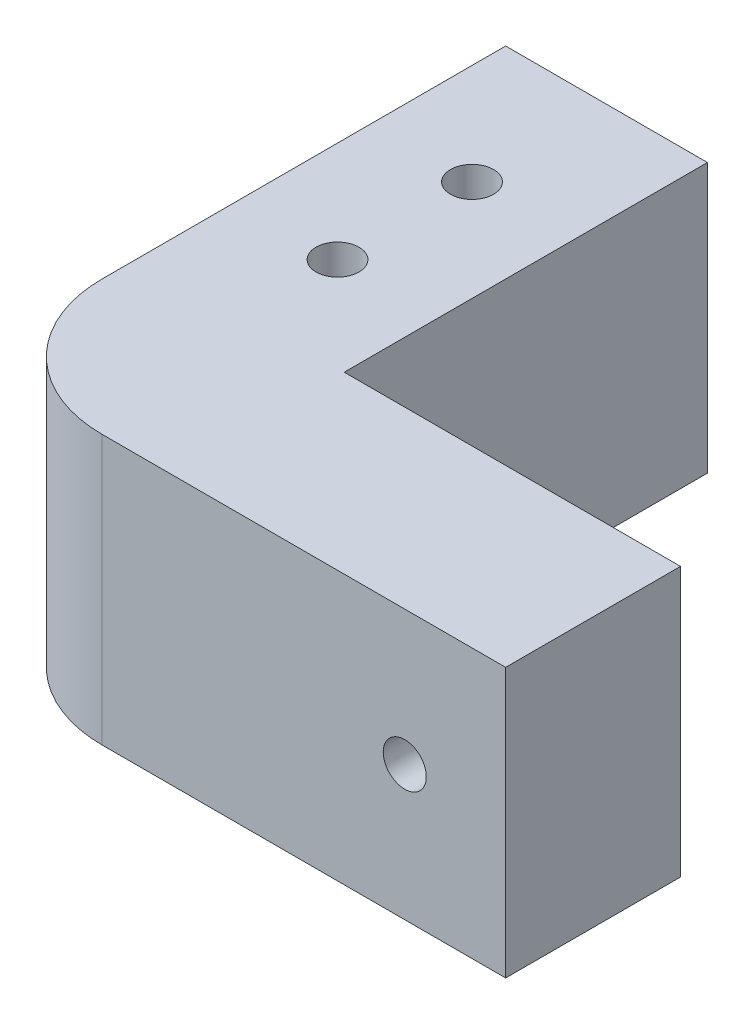
ISO-10303-21;
HEADER;
FILE_DESCRIPTION(('STEP AP214'),'2;1');
FILE_NAME('part.step','',(''),(''),'','','');
FILE_SCHEMA(('AUTOMOTIVE_DESIGN { 1 0 10303 214 1 1 1 1 }'));
ENDSEC;
DATA;
#1=APPLICATION_CONTEXT('core data for automotive mechanical design processes');
#2=APPLICATION_PROTOCOL_DEFINITION('international standard','automotive_design',2000,#1);
#3=PRODUCT_CONTEXT('',#1,'mechanical');
#4=PRODUCT('Part','Part','',(#3));
#5=PRODUCT_RELATED_PRODUCT_CATEGORY('part','',(#4));
#6=PRODUCT_DEFINITION_FORMATION('','',#4);
#7=PRODUCT_DEFINITION_CONTEXT('part definition',#1,'design');
#8=PRODUCT_DEFINITION('design','',#6,#7);
#9=PRODUCT_DEFINITION_SHAPE('','',#8);
#10=(LENGTH_UNIT() NAMED_UNIT(*) SI_UNIT(.MILLI.,.METRE.));
#11=(NAMED_UNIT(*) PLANE_ANGLE_UNIT() SI_UNIT($,.RADIAN.));
#12=(NAMED_UNIT(*) SI_UNIT($,.STERADIAN.) SOLID_ANGLE_UNIT());
#13=UNCERTAINTY_MEASURE_WITH_UNIT(LENGTH_MEASURE(1.E-05),#10,'distance_accuracy_value','');
#14=(GEOMETRIC_REPRESENTATION_CONTEXT(3) GLOBAL_UNCERTAINTY_ASSIGNED_CONTEXT((#13)) GLOBAL_UNIT_ASSIGNED_CONTEXT((#10,
#11,#12)) REPRESENTATION_CONTEXT('',''));
#15=CARTESIAN_POINT('',(0.,0.,0.));
#16=DIRECTION('',(0.,0.,1.));
#17=DIRECTION('',(1.,0.,0.));
#18=AXIS2_PLACEMENT_3D('',#15,#16,#17);
#19=CARTESIAN_POINT('',(40.,20.,0.));
#20=DIRECTION('',(-1.,0.,0.));
#21=DIRECTION('',(0.,0.,1.));
#22=AXIS2_PLACEMENT_3D('',#19,#20,#21);
#23=PLANE('',#22);
#24=DIRECTION('',(0.,-1.,0.));
#25=VECTOR('',#24,1.);
#26=CARTESIAN_POINT('',(40.,20.,-13.));
#27=LINE('',#26,#25);
#28=CARTESIAN_POINT('',(40.,20.,-13.));
#29=VERTEX_POINT('',#28);
#30=CARTESIAN_POINT('',(40.,0.,-13.));
#31=VERTEX_POINT('',#30);
#32=EDGE_CURVE('E100',#29,#31,#27,.T.);
#33=ORIENTED_EDGE('',*,*,#32,.F.);
#34=DIRECTION('',(0.,0.,-1.));
#35=VECTOR('',#34,1.);
#36=CARTESIAN_POINT('',(40.,20.,0.));
#37=LINE('',#36,#35);
#38=CARTESIAN_POINT('',(40.,20.,0.));
#39=VERTEX_POINT('',#38);
#40=EDGE_CURVE('E162',#39,#29,#37,.T.);
#41=ORIENTED_EDGE('',*,*,#40,.F.);
#42=DIRECTION('',(0.,-1.,0.));
#43=VECTOR('',#42,1.);
#44=CARTESIAN_POINT('',(40.,20.,0.));
#45=LINE('',#44,#43);
#46=CARTESIAN_POINT('',(40.,0.,0.));
#47=VERTEX_POINT('',#46);
#48=EDGE_CURVE('E125',#39,#47,#45,.T.);
#49=ORIENTED_EDGE('',*,*,#48,.T.);
#50=DIRECTION('',(0.,0.,-1.));
#51=VECTOR('',#50,1.);
#52=CARTESIAN_POINT('',(40.,0.,0.));
#53=LINE('',#52,#51);
#54=EDGE_CURVE('E118',#47,#31,#53,.T.);
#55=ORIENTED_EDGE('',*,*,#54,.T.);
#56=EDGE_LOOP('',(#33,#41,#49,#55));
#57=FACE_BOUND('',#56,.T.);
#58=ADVANCED_FACE('F41',(#57),#23,.F.);
#59=CARTESIAN_POINT('',(32.5,10.,0.));
#60=DIRECTION('',(0.,0.,-1.));
#61=DIRECTION('',(-1.,0.,0.));
#62=AXIS2_PLACEMENT_3D('',#59,#60,#61);
#63=CYLINDRICAL_SURFACE('',#62,1.6);
#64=CARTESIAN_POINT('',(32.5,10.,0.));
#65=DIRECTION('',(0.,0.,-1.));
#66=DIRECTION('',(-1.,0.,0.));
#67=AXIS2_PLACEMENT_3D('',#64,#65,#66);
#68=CIRCLE('',#67,1.6);
#69=CARTESIAN_POINT('',(30.9,10.,0.));
#70=VERTEX_POINT('',#69);
#71=EDGE_CURVE('E144',#70,#70,#68,.T.);
#72=ORIENTED_EDGE('',*,*,#71,.F.);
#73=EDGE_LOOP('',(#72));
#74=FACE_BOUND('',#73,.T.);
#75=CARTESIAN_POINT('',(32.5,10.,-13.));
#76=DIRECTION('',(0.,0.,-1.));
#77=DIRECTION('',(-1.,0.,0.));
#78=AXIS2_PLACEMENT_3D('',#75,#76,#77);
#79=CIRCLE('',#78,1.6);
#80=CARTESIAN_POINT('',(30.9,10.,-13.));
#81=VERTEX_POINT('',#80);
#82=EDGE_CURVE('E141',#81,#81,#79,.F.);
#83=ORIENTED_EDGE('',*,*,#82,.F.);
#84=EDGE_LOOP('',(#83));
#85=FACE_BOUND('',#84,.T.);
#86=ADVANCED_FACE('F201',(#74,#85),#63,.F.);
#87=CARTESIAN_POINT('',(0.,20.,0.));
#88=DIRECTION('',(0.,-1.,0.));
#89=DIRECTION('',(0.,0.,-1.));
#90=AXIS2_PLACEMENT_3D('',#87,#88,#89);
#91=PLANE('',#90);
#92=DIRECTION('',(0.,0.,1.));
#93=VECTOR('',#92,1.);
#94=CARTESIAN_POINT('',(0.,20.,0.));
#95=LINE('',#94,#93);
#96=CARTESIAN_POINT('',(0.,20.,-40.));
#97=VERTEX_POINT('',#96);
#98=CARTESIAN_POINT('',(0.,20.,-10.));
#99=VERTEX_POINT('',#98);
#100=EDGE_CURVE('E129',#97,#99,#95,.T.);
#101=ORIENTED_EDGE('',*,*,#100,.T.);
#102=CARTESIAN_POINT('',(10.,20.,-10.));
#103=DIRECTION('',(0.,-1.,0.));
#104=DIRECTION('',(0.,0.,-1.));
#105=AXIS2_PLACEMENT_3D('',#102,#103,#104);
#106=CIRCLE('',#105,10.);
#107=CARTESIAN_POINT('',(10.,20.,0.));
#108=VERTEX_POINT('',#107);
#109=EDGE_CURVE('E11',#99,#108,#106,.F.);
#110=ORIENTED_EDGE('',*,*,#109,.T.);
#111=DIRECTION('',(1.,0.,0.));
#112=VECTOR('',#111,1.);
#113=CARTESIAN_POINT('',(0.,20.,0.));
#114=LINE('',#113,#112);
#115=EDGE_CURVE('E152',#108,#39,#114,.T.);
#116=ORIENTED_EDGE('',*,*,#115,.T.);
#117=ORIENTED_EDGE('',*,*,#40,.T.);
#118=DIRECTION('',(1.,0.,0.));
#119=VECTOR('',#118,1.);
#120=CARTESIAN_POINT('',(40.,20.,-13.));
#121=LINE('',#120,#119);
#122=CARTESIAN_POINT('',(15.,20.,-13.));
#123=VERTEX_POINT('',#122);
#124=EDGE_CURVE('E108',#123,#29,#121,.T.);
#125=ORIENTED_EDGE('',*,*,#124,.F.);
#126=DIRECTION('',(0.,0.,-1.));
#127=VECTOR('',#126,1.);
#128=CARTESIAN_POINT('',(15.,20.,-13.));
#129=LINE('',#128,#127);
#130=CARTESIAN_POINT('',(15.,20.,-40.));
#131=VERTEX_POINT('',#130);
#132=EDGE_CURVE('E145',#123,#131,#129,.T.);
#133=ORIENTED_EDGE('',*,*,#132,.T.);
#134=DIRECTION('',(-1.,0.,0.));
#135=VECTOR('',#134,1.);
#136=CARTESIAN_POINT('',(0.,20.,-40.));
#137=LINE('',#136,#135);
#138=EDGE_CURVE('E138',#131,#97,#137,.T.);
#139=ORIENTED_EDGE('',*,*,#138,.T.);
#140=EDGE_LOOP('',(#101,#110,#116,#117,#125,#133,#139));
#141=FACE_BOUND('',#140,.T.);
#142=CARTESIAN_POINT('',(7.5,20.,-30.));
#143=DIRECTION('',(0.,1.,0.));
#144=DIRECTION('',(0.,0.,1.));
#145=AXIS2_PLACEMENT_3D('',#142,#143,#144);
#146=CIRCLE('',#145,1.6);
#147=CARTESIAN_POINT('',(7.5,20.,-28.4));
#148=VERTEX_POINT('',#147);
#149=EDGE_CURVE('E169',#148,#148,#146,.T.);
#150=ORIENTED_EDGE('',*,*,#149,.F.);
#151=EDGE_LOOP('',(#150));
#152=FACE_BOUND('',#151,.T.);
#153=CARTESIAN_POINT('',(7.5,20.,-20.));
#154=DIRECTION('',(0.,1.,0.));
#155=DIRECTION('',(0.,0.,1.));
#156=AXIS2_PLACEMENT_3D('',#153,#154,#155);
#157=CIRCLE('',#156,1.6);
#158=CARTESIAN_POINT('',(7.5,20.,-18.4));
#159=VERTEX_POINT('',#158);
#160=EDGE_CURVE('E174',#159,#159,#157,.T.);
#161=ORIENTED_EDGE('',*,*,#160,.F.);
#162=EDGE_LOOP('',(#161));
#163=FACE_BOUND('',#162,.T.);
#164=ADVANCED_FACE('F156',(#141,#152,#163),#91,.F.);
#165=CARTESIAN_POINT('',(0.,0.,0.));
#166=DIRECTION('',(0.,-1.,0.));
#167=DIRECTION('',(0.,0.,-1.));
#168=AXIS2_PLACEMENT_3D('',#165,#166,#167);
#169=PLANE('',#168);
#170=DIRECTION('',(1.,0.,0.));
#171=VECTOR('',#170,1.);
#172=CARTESIAN_POINT('',(0.,0.,0.));
#173=LINE('',#172,#171);
#174=CARTESIAN_POINT('',(10.,0.,0.));
#175=VERTEX_POINT('',#174);
#176=EDGE_CURVE('E127',#175,#47,#173,.T.);
#177=ORIENTED_EDGE('',*,*,#176,.F.);
#178=CARTESIAN_POINT('',(10.,0.,-10.));
#179=DIRECTION('',(0.,-1.,0.));
#180=DIRECTION('',(0.,0.,-1.));
#181=AXIS2_PLACEMENT_3D('',#178,#179,#180);
#182=CIRCLE('',#181,10.);
#183=CARTESIAN_POINT('',(0.,0.,-10.));
#184=VERTEX_POINT('',#183);
#185=EDGE_CURVE('E63',#175,#184,#182,.T.);
#186=ORIENTED_EDGE('',*,*,#185,.T.);
#187=DIRECTION('',(0.,0.,1.));
#188=VECTOR('',#187,1.);
#189=CARTESIAN_POINT('',(0.,0.,0.));
#190=LINE('',#189,#188);
#191=CARTESIAN_POINT('',(0.,0.,-40.));
#192=VERTEX_POINT('',#191);
#193=EDGE_CURVE('E131',#192,#184,#190,.T.);
#194=ORIENTED_EDGE('',*,*,#193,.F.);
#195=DIRECTION('',(-1.,0.,0.));
#196=VECTOR('',#195,1.);
#197=CARTESIAN_POINT('',(0.,0.,-40.));
#198=LINE('',#197,#196);
#199=CARTESIAN_POINT('',(15.,0.,-40.));
#200=VERTEX_POINT('',#199);
#201=EDGE_CURVE('E126',#200,#192,#198,.T.);
#202=ORIENTED_EDGE('',*,*,#201,.F.);
#203=DIRECTION('',(0.,0.,-1.));
#204=VECTOR('',#203,1.);
#205=CARTESIAN_POINT('',(15.,0.,-13.));
#206=LINE('',#205,#204);
#207=CARTESIAN_POINT('',(15.,0.,-13.));
#208=VERTEX_POINT('',#207);
#209=EDGE_CURVE('E120',#208,#200,#206,.T.);
#210=ORIENTED_EDGE('',*,*,#209,.F.);
#211=DIRECTION('',(-1.,0.,0.));
#212=VECTOR('',#211,1.);
#213=CARTESIAN_POINT('',(40.,0.,-13.));
#214=LINE('',#213,#212);
#215=EDGE_CURVE('E105',#31,#208,#214,.T.);
#216=ORIENTED_EDGE('',*,*,#215,.F.);
#217=ORIENTED_EDGE('',*,*,#54,.F.);
#218=EDGE_LOOP('',(#177,#186,#194,#202,#210,#216,#217));
#219=FACE_BOUND('',#218,.T.);
#220=CARTESIAN_POINT('',(7.5,0.,-30.));
#221=DIRECTION('',(0.,1.,0.));
#222=DIRECTION('',(0.,0.,1.));
#223=AXIS2_PLACEMENT_3D('',#220,#221,#222);
#224=CIRCLE('',#223,1.6);
#225=CARTESIAN_POINT('',(7.5,0.,-28.4));
#226=VERTEX_POINT('',#225);
#227=EDGE_CURVE('E165',#226,#226,#224,.T.);
#228=ORIENTED_EDGE('',*,*,#227,.T.);
#229=EDGE_LOOP('',(#228));
#230=FACE_BOUND('',#229,.T.);
#231=CARTESIAN_POINT('',(7.5,0.,-20.));
#232=DIRECTION('',(0.,1.,0.));
#233=DIRECTION('',(0.,0.,1.));
#234=AXIS2_PLACEMENT_3D('',#231,#232,#233);
#235=CIRCLE('',#234,1.6);
#236=CARTESIAN_POINT('',(7.5,0.,-18.4));
#237=VERTEX_POINT('',#236);
#238=EDGE_CURVE('E176',#237,#237,#235,.T.);
#239=ORIENTED_EDGE('',*,*,#238,.T.);
#240=EDGE_LOOP('',(#239));
#241=FACE_BOUND('',#240,.T.);
#242=ADVANCED_FACE('F116',(#219,#230,#241),#169,.T.);
#243=CARTESIAN_POINT('',(0.,20.,0.));
#244=DIRECTION('',(1.,0.,0.));
#245=DIRECTION('',(0.,0.,-1.));
#246=AXIS2_PLACEMENT_3D('',#243,#244,#245);
#247=PLANE('',#246);
#248=ORIENTED_EDGE('',*,*,#193,.T.);
#249=DIRECTION('',(0.,-1.,0.));
#250=VECTOR('',#249,1.);
#251=CARTESIAN_POINT('',(0.,20.,-10.));
#252=LINE('',#251,#250);
#253=EDGE_CURVE('E49',#184,#99,#252,.F.);
#254=ORIENTED_EDGE('',*,*,#253,.T.);
#255=ORIENTED_EDGE('',*,*,#100,.F.);
#256=DIRECTION('',(0.,-1.,0.));
#257=VECTOR('',#256,1.);
#258=CARTESIAN_POINT('',(0.,20.,-40.));
#259=LINE('',#258,#257);
#260=EDGE_CURVE('E135',#97,#192,#259,.T.);
#261=ORIENTED_EDGE('',*,*,#260,.T.);
#262=EDGE_LOOP('',(#248,#254,#255,#261));
#263=FACE_BOUND('',#262,.T.);
#264=ADVANCED_FACE('F191',(#263),#247,.F.);
#265=CARTESIAN_POINT('',(0.,20.,0.));
#266=DIRECTION('',(0.,0.,-1.));
#267=DIRECTION('',(-1.,0.,0.));
#268=AXIS2_PLACEMENT_3D('',#265,#266,#267);
#269=PLANE('',#268);
#270=ORIENTED_EDGE('',*,*,#71,.T.);
#271=EDGE_LOOP('',(#270));
#272=FACE_BOUND('',#271,.T.);
#273=ORIENTED_EDGE('',*,*,#115,.F.);
#274=DIRECTION('',(0.,-1.,0.));
#275=VECTOR('',#274,1.);
#276=CARTESIAN_POINT('',(10.,20.,0.));
#277=LINE('',#276,#275);
#278=EDGE_CURVE('E140',#108,#175,#277,.T.);
#279=ORIENTED_EDGE('',*,*,#278,.T.);
#280=ORIENTED_EDGE('',*,*,#176,.T.);
#281=ORIENTED_EDGE('',*,*,#48,.F.);
#282=EDGE_LOOP('',(#273,#279,#280,#281));
#283=FACE_BOUND('',#282,.T.);
#284=ADVANCED_FACE('F151',(#272,#283),#269,.F.);
#285=CARTESIAN_POINT('',(0.,20.,-40.));
#286=DIRECTION('',(0.,0.,1.));
#287=DIRECTION('',(1.,0.,0.));
#288=AXIS2_PLACEMENT_3D('',#285,#286,#287);
#289=PLANE('',#288);
#290=ORIENTED_EDGE('',*,*,#138,.F.);
#291=DIRECTION('',(0.,1.,0.));
#292=VECTOR('',#291,1.);
#293=CARTESIAN_POINT('',(15.,20.,-40.));
#294=LINE('',#293,#292);
#295=EDGE_CURVE('E113',#200,#131,#294,.T.);
#296=ORIENTED_EDGE('',*,*,#295,.F.);
#297=ORIENTED_EDGE('',*,*,#201,.T.);
#298=ORIENTED_EDGE('',*,*,#260,.F.);
#299=EDGE_LOOP('',(#290,#296,#297,#298));
#300=FACE_BOUND('',#299,.T.);
#301=ADVANCED_FACE('F190',(#300),#289,.F.);
#302=CARTESIAN_POINT('',(7.5,20.,-30.));
#303=DIRECTION('',(0.,-1.,0.));
#304=DIRECTION('',(0.,0.,-1.));
#305=AXIS2_PLACEMENT_3D('',#302,#303,#304);
#306=CYLINDRICAL_SURFACE('',#305,1.6);
#307=ORIENTED_EDGE('',*,*,#149,.T.);
#308=EDGE_LOOP('',(#307));
#309=FACE_BOUND('',#308,.T.);
#310=ORIENTED_EDGE('',*,*,#227,.F.);
#311=EDGE_LOOP('',(#310));
#312=FACE_BOUND('',#311,.T.);
#313=ADVANCED_FACE('F211',(#309,#312),#306,.F.);
#314=CARTESIAN_POINT('',(7.5,20.,-20.));
#315=DIRECTION('',(0.,-1.,0.));
#316=DIRECTION('',(0.,0.,-1.));
#317=AXIS2_PLACEMENT_3D('',#314,#315,#316);
#318=CYLINDRICAL_SURFACE('',#317,1.6);
#319=ORIENTED_EDGE('',*,*,#160,.T.);
#320=EDGE_LOOP('',(#319));
#321=FACE_BOUND('',#320,.T.);
#322=ORIENTED_EDGE('',*,*,#238,.F.);
#323=EDGE_LOOP('',(#322));
#324=FACE_BOUND('',#323,.T.);
#325=ADVANCED_FACE('F217',(#321,#324),#318,.F.);
#326=CARTESIAN_POINT('',(0.,0.,-13.));
#327=DIRECTION('',(0.,0.,-1.));
#328=DIRECTION('',(-1.,0.,0.));
#329=AXIS2_PLACEMENT_3D('',#326,#327,#328);
#330=PLANE('',#329);
#331=ORIENTED_EDGE('',*,*,#32,.T.);
#332=ORIENTED_EDGE('',*,*,#215,.T.);
#333=DIRECTION('',(0.,1.,0.));
#334=VECTOR('',#333,1.);
#335=CARTESIAN_POINT('',(15.,20.,-13.));
#336=LINE('',#335,#334);
#337=EDGE_CURVE('E121',#208,#123,#336,.T.);
#338=ORIENTED_EDGE('',*,*,#337,.T.);
#339=ORIENTED_EDGE('',*,*,#124,.T.);
#340=EDGE_LOOP('',(#331,#332,#338,#339));
#341=FACE_BOUND('',#340,.T.);
#342=ORIENTED_EDGE('',*,*,#82,.T.);
#343=EDGE_LOOP('',(#342));
#344=FACE_BOUND('',#343,.T.);
#345=ADVANCED_FACE('F102',(#341,#344),#330,.T.);
#346=CARTESIAN_POINT('',(15.,20.,-13.));
#347=DIRECTION('',(-1.,0.,0.));
#348=DIRECTION('',(0.,-1.,0.));
#349=AXIS2_PLACEMENT_3D('',#346,#347,#348);
#350=PLANE('',#349);
#351=ORIENTED_EDGE('',*,*,#295,.T.);
#352=ORIENTED_EDGE('',*,*,#132,.F.);
#353=ORIENTED_EDGE('',*,*,#337,.F.);
#354=ORIENTED_EDGE('',*,*,#209,.T.);
#355=EDGE_LOOP('',(#351,#352,#353,#354));
#356=FACE_BOUND('',#355,.T.);
#357=ADVANCED_FACE('F220',(#356),#350,.F.);
#358=CARTESIAN_POINT('',(10.,20.,-10.));
#359=DIRECTION('',(0.,-1.,0.));
#360=DIRECTION('',(0.,0.,-1.));
#361=AXIS2_PLACEMENT_3D('',#358,#359,#360);
#362=CYLINDRICAL_SURFACE('',#361,10.);
#363=ORIENTED_EDGE('',*,*,#109,.F.);
#364=ORIENTED_EDGE('',*,*,#253,.F.);
#365=ORIENTED_EDGE('',*,*,#185,.F.);
#366=ORIENTED_EDGE('',*,*,#278,.F.);
#367=EDGE_LOOP('',(#363,#364,#365,#366));
#368=FACE_BOUND('',#367,.T.);
#369=ADVANCED_FACE('F43',(#368),#362,.T.);
#370=CLOSED_SHELL('',(#58,#86,#164,#242,#264,#284,#301,#313,#325,#345,#357,#369));
#371=MANIFOLD_SOLID_BREP('B2',#370);
#372=ADVANCED_BREP_SHAPE_REPRESENTATION('',(#18,#371),#14);
#373=SHAPE_DEFINITION_REPRESENTATION(#9,#372);
ENDSEC;
END-ISO-10303-21;
